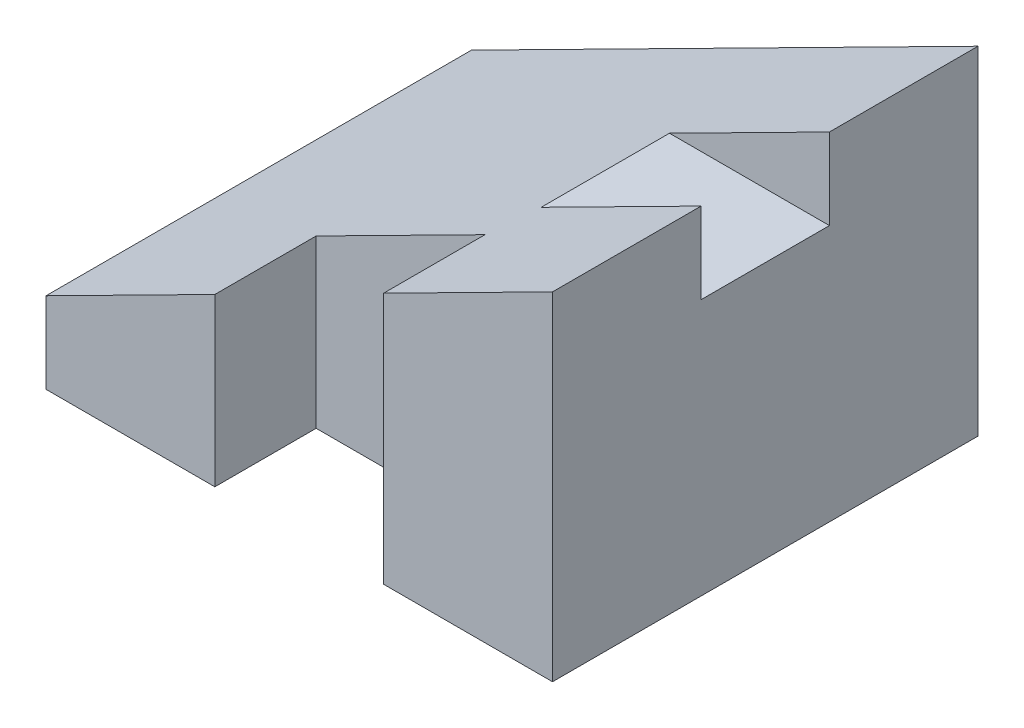
ISO-10303-21;
HEADER;
FILE_DESCRIPTION(('STEP AP214'),'2;1');
FILE_NAME('part.step','',(''),(''),'','','');
FILE_SCHEMA(('AUTOMOTIVE_DESIGN { 1 0 10303 214 1 1 1 1 }'));
ENDSEC;
DATA;
#1=APPLICATION_CONTEXT('core data for automotive mechanical design processes');
#2=APPLICATION_PROTOCOL_DEFINITION('international standard','automotive_design',2000,#1);
#3=PRODUCT_CONTEXT('',#1,'mechanical');
#4=PRODUCT('Part','Part','',(#3));
#5=PRODUCT_RELATED_PRODUCT_CATEGORY('part','',(#4));
#6=PRODUCT_DEFINITION_FORMATION('','',#4);
#7=PRODUCT_DEFINITION_CONTEXT('part definition',#1,'design');
#8=PRODUCT_DEFINITION('design','',#6,#7);
#9=PRODUCT_DEFINITION_SHAPE('','',#8);
#10=(LENGTH_UNIT() NAMED_UNIT(*) SI_UNIT(.MILLI.,.METRE.));
#11=(NAMED_UNIT(*) PLANE_ANGLE_UNIT() SI_UNIT($,.RADIAN.));
#12=(NAMED_UNIT(*) SI_UNIT($,.STERADIAN.) SOLID_ANGLE_UNIT());
#13=UNCERTAINTY_MEASURE_WITH_UNIT(LENGTH_MEASURE(1.E-05),#10,'distance_accuracy_value','');
#14=(GEOMETRIC_REPRESENTATION_CONTEXT(3) GLOBAL_UNCERTAINTY_ASSIGNED_CONTEXT((#13)) GLOBAL_UNIT_ASSIGNED_CONTEXT((#10,
#11,#12)) REPRESENTATION_CONTEXT('',''));
#15=CARTESIAN_POINT('',(0.,0.,0.));
#16=DIRECTION('',(0.,0.,1.));
#17=DIRECTION('',(1.,0.,0.));
#18=AXIS2_PLACEMENT_3D('',#15,#16,#17);
#19=CARTESIAN_POINT('',(0.,0.,63.));
#20=DIRECTION('',(0.,0.,-1.));
#21=DIRECTION('',(-1.,0.,0.));
#22=AXIS2_PLACEMENT_3D('',#19,#20,#21);
#23=PLANE('',#22);
#24=DIRECTION('',(-0.892035776030268,-0.451964793188669,0.));
#25=VECTOR('',#24,1.);
#26=CARTESIAN_POINT('',(0.,12.,63.));
#27=LINE('',#26,#25);
#28=CARTESIAN_POINT('',(75.,50.,63.));
#29=VERTEX_POINT('',#28);
#30=CARTESIAN_POINT('',(50.,37.3333333333333,63.));
#31=VERTEX_POINT('',#30);
#32=EDGE_CURVE('E135',#29,#31,#27,.T.);
#33=ORIENTED_EDGE('',*,*,#32,.T.);
#34=DIRECTION('',(0.,1.,0.));
#35=VECTOR('',#34,1.);
#36=CARTESIAN_POINT('',(50.,37.3333333333333,63.));
#37=LINE('',#36,#35);
#38=CARTESIAN_POINT('',(50.,0.,63.));
#39=VERTEX_POINT('',#38);
#40=EDGE_CURVE('E149',#39,#31,#37,.T.);
#41=ORIENTED_EDGE('',*,*,#40,.F.);
#42=DIRECTION('',(1.,0.,0.));
#43=VECTOR('',#42,1.);
#44=CARTESIAN_POINT('',(75.,0.,63.));
#45=LINE('',#44,#43);
#46=CARTESIAN_POINT('',(75.,0.,63.));
#47=VERTEX_POINT('',#46);
#48=EDGE_CURVE('E184',#39,#47,#45,.T.);
#49=ORIENTED_EDGE('',*,*,#48,.T.);
#50=DIRECTION('',(0.,1.,0.));
#51=VECTOR('',#50,1.);
#52=CARTESIAN_POINT('',(75.,50.,63.));
#53=LINE('',#52,#51);
#54=EDGE_CURVE('E177',#47,#29,#53,.T.);
#55=ORIENTED_EDGE('',*,*,#54,.T.);
#56=EDGE_LOOP('',(#33,#41,#49,#55));
#57=FACE_BOUND('',#56,.T.);
#58=ADVANCED_FACE('F33',(#57),#23,.F.);
#59=CARTESIAN_POINT('',(75.,50.,63.));
#60=DIRECTION('',(-1.,0.,0.));
#61=DIRECTION('',(0.,0.,1.));
#62=AXIS2_PLACEMENT_3D('',#59,#60,#61);
#63=PLANE('',#62);
#64=DIRECTION('',(0.,0.,-1.));
#65=VECTOR('',#64,1.);
#66=CARTESIAN_POINT('',(75.,50.,63.));
#67=LINE('',#66,#65);
#68=CARTESIAN_POINT('',(75.,50.,22.));
#69=VERTEX_POINT('',#68);
#70=CARTESIAN_POINT('',(75.,50.,0.));
#71=VERTEX_POINT('',#70);
#72=EDGE_CURVE('E137',#69,#71,#67,.T.);
#73=ORIENTED_EDGE('',*,*,#72,.F.);
#74=DIRECTION('',(0.,1.,0.));
#75=VECTOR('',#74,1.);
#76=CARTESIAN_POINT('',(75.,38.,22.));
#77=LINE('',#76,#75);
#78=CARTESIAN_POINT('',(75.,38.,22.));
#79=VERTEX_POINT('',#78);
#80=EDGE_CURVE('E151',#79,#69,#77,.T.);
#81=ORIENTED_EDGE('',*,*,#80,.F.);
#82=DIRECTION('',(0.,0.,-1.));
#83=VECTOR('',#82,1.);
#84=CARTESIAN_POINT('',(75.,38.,41.));
#85=LINE('',#84,#83);
#86=CARTESIAN_POINT('',(75.,38.,41.));
#87=VERTEX_POINT('',#86);
#88=EDGE_CURVE('E130',#87,#79,#85,.T.);
#89=ORIENTED_EDGE('',*,*,#88,.F.);
#90=DIRECTION('',(0.,-1.,0.));
#91=VECTOR('',#90,1.);
#92=CARTESIAN_POINT('',(75.,50.,41.));
#93=LINE('',#92,#91);
#94=CARTESIAN_POINT('',(75.,50.,41.));
#95=VERTEX_POINT('',#94);
#96=EDGE_CURVE('E117',#95,#87,#93,.T.);
#97=ORIENTED_EDGE('',*,*,#96,.F.);
#98=EDGE_CURVE('E122',#29,#95,#67,.T.);
#99=ORIENTED_EDGE('',*,*,#98,.F.);
#100=ORIENTED_EDGE('',*,*,#54,.F.);
#101=DIRECTION('',(0.,0.,-1.));
#102=VECTOR('',#101,1.);
#103=CARTESIAN_POINT('',(75.,0.,63.));
#104=LINE('',#103,#102);
#105=CARTESIAN_POINT('',(75.,0.,0.));
#106=VERTEX_POINT('',#105);
#107=EDGE_CURVE('E188',#47,#106,#104,.T.);
#108=ORIENTED_EDGE('',*,*,#107,.T.);
#109=DIRECTION('',(0.,1.,0.));
#110=VECTOR('',#109,1.);
#111=CARTESIAN_POINT('',(75.,50.,0.));
#112=LINE('',#111,#110);
#113=EDGE_CURVE('E170',#106,#71,#112,.T.);
#114=ORIENTED_EDGE('',*,*,#113,.T.);
#115=EDGE_LOOP('',(#73,#81,#89,#97,#99,#100,#108,#114));
#116=FACE_BOUND('',#115,.T.);
#117=ADVANCED_FACE('F35',(#116),#63,.F.);
#118=CARTESIAN_POINT('',(0.,12.,63.));
#119=DIRECTION('',(0.45196479318867,-0.892035776030269,0.));
#120=DIRECTION('',(0.892035776030269,0.45196479318867,0.));
#121=AXIS2_PLACEMENT_3D('',#118,#119,#120);
#122=PLANE('',#121);
#123=DIRECTION('',(0.,0.,-1.));
#124=VECTOR('',#123,1.);
#125=CARTESIAN_POINT('',(51.3157894736842,38.,63.0000000000001));
#126=LINE('',#125,#124);
#127=CARTESIAN_POINT('',(51.3157894736842,38.,41.));
#128=VERTEX_POINT('',#127);
#129=CARTESIAN_POINT('',(51.3157894736842,38.,22.));
#130=VERTEX_POINT('',#129);
#131=EDGE_CURVE('E41',#128,#130,#126,.T.);
#132=ORIENTED_EDGE('',*,*,#131,.T.);
#133=DIRECTION('',(0.892035776030269,0.45196479318867,0.));
#134=VECTOR('',#133,1.);
#135=CARTESIAN_POINT('',(0.,12.,22.));
#136=LINE('',#135,#134);
#137=EDGE_CURVE('E11',#130,#69,#136,.T.);
#138=ORIENTED_EDGE('',*,*,#137,.T.);
#139=ORIENTED_EDGE('',*,*,#72,.T.);
#140=DIRECTION('',(-0.892035776030268,-0.451964793188669,0.));
#141=VECTOR('',#140,1.);
#142=CARTESIAN_POINT('',(0.,12.,0.));
#143=LINE('',#142,#141);
#144=CARTESIAN_POINT('',(0.,12.,0.));
#145=VERTEX_POINT('',#144);
#146=EDGE_CURVE('E191',#71,#145,#143,.T.);
#147=ORIENTED_EDGE('',*,*,#146,.T.);
#148=DIRECTION('',(0.,0.,-1.));
#149=VECTOR('',#148,1.);
#150=CARTESIAN_POINT('',(0.,12.,63.));
#151=LINE('',#150,#149);
#152=CARTESIAN_POINT('',(0.,12.,63.));
#153=VERTEX_POINT('',#152);
#154=EDGE_CURVE('E139',#153,#145,#151,.T.);
#155=ORIENTED_EDGE('',*,*,#154,.F.);
#156=CARTESIAN_POINT('',(25.,24.6666666666667,63.));
#157=VERTEX_POINT('',#156);
#158=EDGE_CURVE('E179',#157,#153,#27,.T.);
#159=ORIENTED_EDGE('',*,*,#158,.F.);
#160=DIRECTION('',(0.,0.,1.));
#161=VECTOR('',#160,1.);
#162=CARTESIAN_POINT('',(25.,24.6666666666667,48.));
#163=LINE('',#162,#161);
#164=CARTESIAN_POINT('',(25.,24.6666666666667,48.));
#165=VERTEX_POINT('',#164);
#166=EDGE_CURVE('E56',#165,#157,#163,.T.);
#167=ORIENTED_EDGE('',*,*,#166,.F.);
#168=DIRECTION('',(-0.892035776030268,-0.45196479318867,0.));
#169=VECTOR('',#168,1.);
#170=CARTESIAN_POINT('',(25.,24.6666666666667,48.));
#171=LINE('',#170,#169);
#172=CARTESIAN_POINT('',(50.,37.3333333333333,48.));
#173=VERTEX_POINT('',#172);
#174=EDGE_CURVE('E156',#173,#165,#171,.T.);
#175=ORIENTED_EDGE('',*,*,#174,.F.);
#176=DIRECTION('',(0.,0.,1.));
#177=VECTOR('',#176,1.);
#178=CARTESIAN_POINT('',(50.,37.3333333333333,48.));
#179=LINE('',#178,#177);
#180=EDGE_CURVE('E168',#173,#31,#179,.T.);
#181=ORIENTED_EDGE('',*,*,#180,.T.);
#182=ORIENTED_EDGE('',*,*,#32,.F.);
#183=ORIENTED_EDGE('',*,*,#98,.T.);
#184=DIRECTION('',(-0.892035776030269,-0.45196479318867,0.));
#185=VECTOR('',#184,1.);
#186=CARTESIAN_POINT('',(0.,12.,41.));
#187=LINE('',#186,#185);
#188=EDGE_CURVE('E114',#95,#128,#187,.T.);
#189=ORIENTED_EDGE('',*,*,#188,.T.);
#190=EDGE_LOOP('',(#132,#138,#139,#147,#155,#159,#167,#175,#181,#182,#183,#189));
#191=FACE_BOUND('',#190,.T.);
#192=ADVANCED_FACE('F132',(#191),#122,.F.);
#193=CARTESIAN_POINT('',(0.,0.,63.));
#194=DIRECTION('',(1.,0.,0.));
#195=DIRECTION('',(0.,0.,-1.));
#196=AXIS2_PLACEMENT_3D('',#193,#194,#195);
#197=PLANE('',#196);
#198=DIRECTION('',(0.,-1.,0.));
#199=VECTOR('',#198,1.);
#200=CARTESIAN_POINT('',(0.,0.,0.));
#201=LINE('',#200,#199);
#202=CARTESIAN_POINT('',(0.,0.,0.));
#203=VERTEX_POINT('',#202);
#204=EDGE_CURVE('E193',#145,#203,#201,.T.);
#205=ORIENTED_EDGE('',*,*,#204,.T.);
#206=DIRECTION('',(0.,0.,-1.));
#207=VECTOR('',#206,1.);
#208=CARTESIAN_POINT('',(0.,0.,63.));
#209=LINE('',#208,#207);
#210=CARTESIAN_POINT('',(0.,0.,63.));
#211=VERTEX_POINT('',#210);
#212=EDGE_CURVE('E197',#211,#203,#209,.T.);
#213=ORIENTED_EDGE('',*,*,#212,.F.);
#214=DIRECTION('',(0.,-1.,0.));
#215=VECTOR('',#214,1.);
#216=CARTESIAN_POINT('',(0.,0.,63.));
#217=LINE('',#216,#215);
#218=EDGE_CURVE('E182',#153,#211,#217,.T.);
#219=ORIENTED_EDGE('',*,*,#218,.F.);
#220=ORIENTED_EDGE('',*,*,#154,.T.);
#221=EDGE_LOOP('',(#205,#213,#219,#220));
#222=FACE_BOUND('',#221,.T.);
#223=ADVANCED_FACE('F208',(#222),#197,.F.);
#224=CARTESIAN_POINT('',(75.,0.,63.));
#225=DIRECTION('',(0.,1.,0.));
#226=DIRECTION('',(0.,0.,1.));
#227=AXIS2_PLACEMENT_3D('',#224,#225,#226);
#228=PLANE('',#227);
#229=ORIENTED_EDGE('',*,*,#48,.F.);
#230=DIRECTION('',(0.,0.,1.));
#231=VECTOR('',#230,1.);
#232=CARTESIAN_POINT('',(50.,0.,48.));
#233=LINE('',#232,#231);
#234=CARTESIAN_POINT('',(50.,0.,48.));
#235=VERTEX_POINT('',#234);
#236=EDGE_CURVE('E171',#235,#39,#233,.T.);
#237=ORIENTED_EDGE('',*,*,#236,.F.);
#238=DIRECTION('',(1.,0.,0.));
#239=VECTOR('',#238,1.);
#240=CARTESIAN_POINT('',(50.,0.,48.));
#241=LINE('',#240,#239);
#242=CARTESIAN_POINT('',(25.,0.,48.));
#243=VERTEX_POINT('',#242);
#244=EDGE_CURVE('E162',#243,#235,#241,.T.);
#245=ORIENTED_EDGE('',*,*,#244,.F.);
#246=DIRECTION('',(0.,0.,1.));
#247=VECTOR('',#246,1.);
#248=CARTESIAN_POINT('',(25.,0.,48.));
#249=LINE('',#248,#247);
#250=CARTESIAN_POINT('',(25.,0.,63.));
#251=VERTEX_POINT('',#250);
#252=EDGE_CURVE('E173',#243,#251,#249,.T.);
#253=ORIENTED_EDGE('',*,*,#252,.T.);
#254=EDGE_CURVE('E185',#211,#251,#45,.T.);
#255=ORIENTED_EDGE('',*,*,#254,.F.);
#256=ORIENTED_EDGE('',*,*,#212,.T.);
#257=DIRECTION('',(1.,0.,0.));
#258=VECTOR('',#257,1.);
#259=CARTESIAN_POINT('',(75.,0.,0.));
#260=LINE('',#259,#258);
#261=EDGE_CURVE('E180',#203,#106,#260,.T.);
#262=ORIENTED_EDGE('',*,*,#261,.T.);
#263=ORIENTED_EDGE('',*,*,#107,.F.);
#264=EDGE_LOOP('',(#229,#237,#245,#253,#255,#256,#262,#263));
#265=FACE_BOUND('',#264,.T.);
#266=ADVANCED_FACE('F216',(#265),#228,.F.);
#267=ORIENTED_EDGE('',*,*,#254,.T.);
#268=DIRECTION('',(0.,-1.,0.));
#269=VECTOR('',#268,1.);
#270=CARTESIAN_POINT('',(25.,24.6666666666667,63.));
#271=LINE('',#270,#269);
#272=EDGE_CURVE('E147',#157,#251,#271,.T.);
#273=ORIENTED_EDGE('',*,*,#272,.F.);
#274=ORIENTED_EDGE('',*,*,#158,.T.);
#275=ORIENTED_EDGE('',*,*,#218,.T.);
#276=EDGE_LOOP('',(#267,#273,#274,#275));
#277=FACE_BOUND('',#276,.T.);
#278=ADVANCED_FACE('F228',(#277),#23,.F.);
#279=CARTESIAN_POINT('',(0.,0.,0.));
#280=DIRECTION('',(0.,0.,-1.));
#281=DIRECTION('',(-1.,0.,0.));
#282=AXIS2_PLACEMENT_3D('',#279,#280,#281);
#283=PLANE('',#282);
#284=ORIENTED_EDGE('',*,*,#113,.F.);
#285=ORIENTED_EDGE('',*,*,#261,.F.);
#286=ORIENTED_EDGE('',*,*,#204,.F.);
#287=ORIENTED_EDGE('',*,*,#146,.F.);
#288=EDGE_LOOP('',(#284,#285,#286,#287));
#289=FACE_BOUND('',#288,.T.);
#290=ADVANCED_FACE('F213',(#289),#283,.T.);
#291=CARTESIAN_POINT('',(50.,37.3333333333333,48.));
#292=DIRECTION('',(1.,0.,0.));
#293=DIRECTION('',(0.,1.,0.));
#294=AXIS2_PLACEMENT_3D('',#291,#292,#293);
#295=PLANE('',#294);
#296=ORIENTED_EDGE('',*,*,#40,.T.);
#297=ORIENTED_EDGE('',*,*,#180,.F.);
#298=DIRECTION('',(0.,1.,0.));
#299=VECTOR('',#298,1.);
#300=CARTESIAN_POINT('',(50.,37.3333333333333,48.));
#301=LINE('',#300,#299);
#302=EDGE_CURVE('E164',#235,#173,#301,.T.);
#303=ORIENTED_EDGE('',*,*,#302,.F.);
#304=ORIENTED_EDGE('',*,*,#236,.T.);
#305=EDGE_LOOP('',(#296,#297,#303,#304));
#306=FACE_BOUND('',#305,.T.);
#307=ADVANCED_FACE('F223',(#306),#295,.F.);
#308=CARTESIAN_POINT('',(25.,24.6666666666667,48.));
#309=DIRECTION('',(-1.,0.,0.));
#310=DIRECTION('',(0.,-1.,0.));
#311=AXIS2_PLACEMENT_3D('',#308,#309,#310);
#312=PLANE('',#311);
#313=ORIENTED_EDGE('',*,*,#272,.T.);
#314=ORIENTED_EDGE('',*,*,#252,.F.);
#315=DIRECTION('',(0.,-1.,0.));
#316=VECTOR('',#315,1.);
#317=CARTESIAN_POINT('',(25.,24.6666666666667,48.));
#318=LINE('',#317,#316);
#319=EDGE_CURVE('E159',#165,#243,#318,.T.);
#320=ORIENTED_EDGE('',*,*,#319,.F.);
#321=ORIENTED_EDGE('',*,*,#166,.T.);
#322=EDGE_LOOP('',(#313,#314,#320,#321));
#323=FACE_BOUND('',#322,.T.);
#324=ADVANCED_FACE('F229',(#323),#312,.F.);
#325=CARTESIAN_POINT('',(0.,0.,48.));
#326=DIRECTION('',(0.,0.,-1.));
#327=DIRECTION('',(-1.,0.,0.));
#328=AXIS2_PLACEMENT_3D('',#325,#326,#327);
#329=PLANE('',#328);
#330=ORIENTED_EDGE('',*,*,#174,.T.);
#331=ORIENTED_EDGE('',*,*,#319,.T.);
#332=ORIENTED_EDGE('',*,*,#244,.T.);
#333=ORIENTED_EDGE('',*,*,#302,.T.);
#334=EDGE_LOOP('',(#330,#331,#332,#333));
#335=FACE_BOUND('',#334,.T.);
#336=ADVANCED_FACE('F226',(#335),#329,.F.);
#337=CARTESIAN_POINT('',(50.,38.,22.));
#338=DIRECTION('',(0.,0.,-1.));
#339=DIRECTION('',(0.,1.,0.));
#340=AXIS2_PLACEMENT_3D('',#337,#338,#339);
#341=PLANE('',#340);
#342=DIRECTION('',(1.,0.,0.));
#343=VECTOR('',#342,1.);
#344=CARTESIAN_POINT('',(50.,38.,22.));
#345=LINE('',#344,#343);
#346=EDGE_CURVE('E145',#130,#79,#345,.T.);
#347=ORIENTED_EDGE('',*,*,#346,.T.);
#348=ORIENTED_EDGE('',*,*,#80,.T.);
#349=ORIENTED_EDGE('',*,*,#137,.F.);
#350=EDGE_LOOP('',(#347,#348,#349));
#351=FACE_BOUND('',#350,.T.);
#352=ADVANCED_FACE('F236',(#351),#341,.F.);
#353=CARTESIAN_POINT('',(50.,38.,41.));
#354=DIRECTION('',(0.,-1.,0.));
#355=DIRECTION('',(0.,0.,-1.));
#356=AXIS2_PLACEMENT_3D('',#353,#354,#355);
#357=PLANE('',#356);
#358=DIRECTION('',(1.,0.,0.));
#359=VECTOR('',#358,1.);
#360=CARTESIAN_POINT('',(50.,38.,41.));
#361=LINE('',#360,#359);
#362=EDGE_CURVE('E48',#128,#87,#361,.T.);
#363=ORIENTED_EDGE('',*,*,#362,.T.);
#364=ORIENTED_EDGE('',*,*,#88,.T.);
#365=ORIENTED_EDGE('',*,*,#346,.F.);
#366=ORIENTED_EDGE('',*,*,#131,.F.);
#367=EDGE_LOOP('',(#363,#364,#365,#366));
#368=FACE_BOUND('',#367,.T.);
#369=ADVANCED_FACE('F144',(#368),#357,.F.);
#370=CARTESIAN_POINT('',(50.,50.,41.));
#371=DIRECTION('',(0.,0.,1.));
#372=DIRECTION('',(0.,-1.,0.));
#373=AXIS2_PLACEMENT_3D('',#370,#371,#372);
#374=PLANE('',#373);
#375=ORIENTED_EDGE('',*,*,#96,.T.);
#376=ORIENTED_EDGE('',*,*,#362,.F.);
#377=ORIENTED_EDGE('',*,*,#188,.F.);
#378=EDGE_LOOP('',(#375,#376,#377));
#379=FACE_BOUND('',#378,.T.);
#380=ADVANCED_FACE('F116',(#379),#374,.F.);
#381=CLOSED_SHELL('',(#58,#117,#192,#223,#266,#278,#290,#307,#324,#336,#352,#369,#380));
#382=MANIFOLD_SOLID_BREP('B2',#381);
#383=ADVANCED_BREP_SHAPE_REPRESENTATION('',(#18,#382),#14);
#384=SHAPE_DEFINITION_REPRESENTATION(#9,#383);
ENDSEC;
END-ISO-10303-21;
